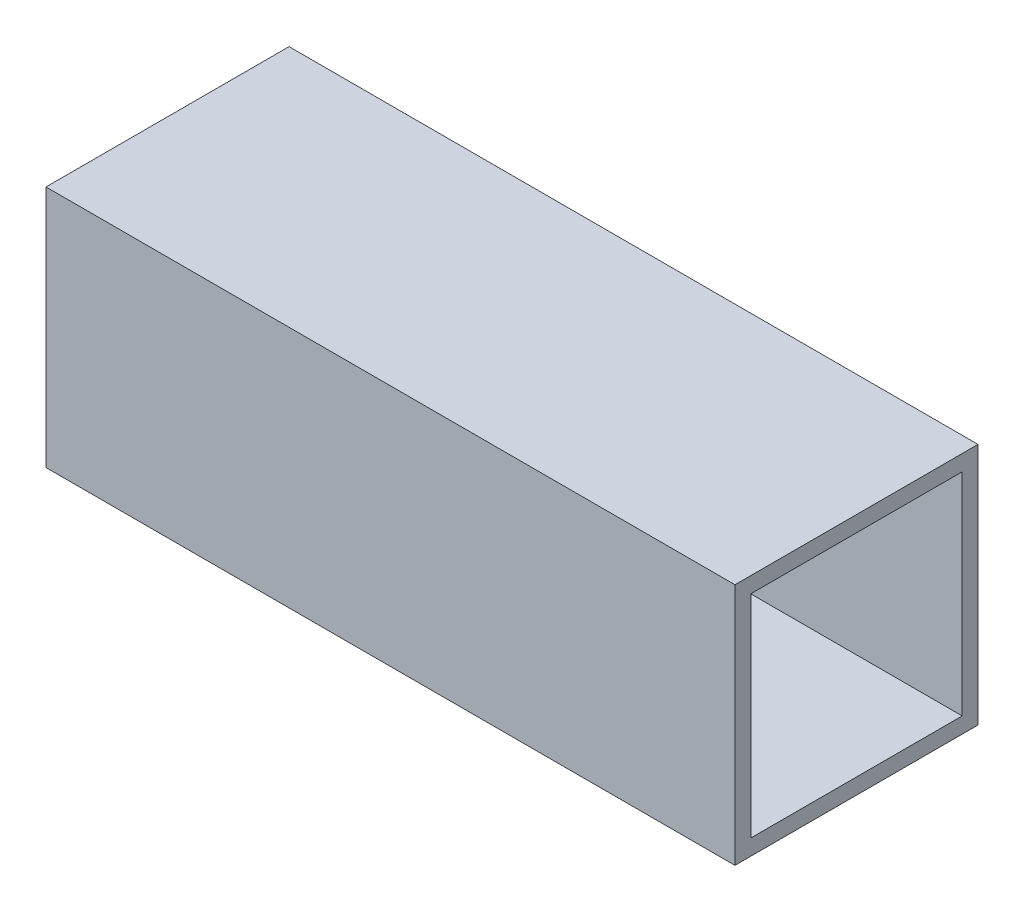
ISO-10303-21;
HEADER;
FILE_DESCRIPTION(('STEP AP214'),'2;1');
FILE_NAME('part.step','',(''),(''),'','','');
FILE_SCHEMA(('AUTOMOTIVE_DESIGN { 1 0 10303 214 1 1 1 1 }'));
ENDSEC;
DATA;
#1=APPLICATION_CONTEXT('core data for automotive mechanical design processes');
#2=APPLICATION_PROTOCOL_DEFINITION('international standard','automotive_design',2000,#1);
#3=PRODUCT_CONTEXT('',#1,'mechanical');
#4=PRODUCT('Part','Part','',(#3));
#5=PRODUCT_RELATED_PRODUCT_CATEGORY('part','',(#4));
#6=PRODUCT_DEFINITION_FORMATION('','',#4);
#7=PRODUCT_DEFINITION_CONTEXT('part definition',#1,'design');
#8=PRODUCT_DEFINITION('design','',#6,#7);
#9=PRODUCT_DEFINITION_SHAPE('','',#8);
#10=(LENGTH_UNIT() NAMED_UNIT(*) SI_UNIT(.MILLI.,.METRE.));
#11=(NAMED_UNIT(*) PLANE_ANGLE_UNIT() SI_UNIT($,.RADIAN.));
#12=(NAMED_UNIT(*) SI_UNIT($,.STERADIAN.) SOLID_ANGLE_UNIT());
#13=UNCERTAINTY_MEASURE_WITH_UNIT(LENGTH_MEASURE(1.E-05),#10,'distance_accuracy_value','');
#14=(GEOMETRIC_REPRESENTATION_CONTEXT(3) GLOBAL_UNCERTAINTY_ASSIGNED_CONTEXT((#13)) GLOBAL_UNIT_ASSIGNED_CONTEXT((#10,
#11,#12)) REPRESENTATION_CONTEXT('',''));
#15=CARTESIAN_POINT('',(0.,0.,0.));
#16=DIRECTION('',(0.,0.,1.));
#17=DIRECTION('',(1.,0.,0.));
#18=AXIS2_PLACEMENT_3D('',#15,#16,#17);
#19=CARTESIAN_POINT('',(72.,12.7,-12.7));
#20=DIRECTION('',(0.,0.,1.));
#21=DIRECTION('',(1.,0.,0.));
#22=AXIS2_PLACEMENT_3D('',#19,#20,#21);
#23=PLANE('',#22);
#24=DIRECTION('',(0.,1.,0.));
#25=VECTOR('',#24,1.);
#26=CARTESIAN_POINT('',(0.,12.7,-12.7));
#27=LINE('',#26,#25);
#28=CARTESIAN_POINT('',(0.,-12.7,-12.7));
#29=VERTEX_POINT('',#28);
#30=CARTESIAN_POINT('',(0.,12.7,-12.7));
#31=VERTEX_POINT('',#30);
#32=EDGE_CURVE('E177',#29,#31,#27,.T.);
#33=ORIENTED_EDGE('',*,*,#32,.T.);
#34=DIRECTION('',(-1.,0.,0.));
#35=VECTOR('',#34,1.);
#36=CARTESIAN_POINT('',(72.,12.7,-12.7));
#37=LINE('',#36,#35);
#38=CARTESIAN_POINT('',(72.,12.7,-12.7));
#39=VERTEX_POINT('',#38);
#40=EDGE_CURVE('E12',#39,#31,#37,.T.);
#41=ORIENTED_EDGE('',*,*,#40,.F.);
#42=DIRECTION('',(0.,1.,0.));
#43=VECTOR('',#42,1.);
#44=CARTESIAN_POINT('',(72.,12.7,-12.7));
#45=LINE('',#44,#43);
#46=CARTESIAN_POINT('',(72.,-12.7,-12.7));
#47=VERTEX_POINT('',#46);
#48=EDGE_CURVE('E143',#47,#39,#45,.T.);
#49=ORIENTED_EDGE('',*,*,#48,.F.);
#50=DIRECTION('',(-1.,0.,0.));
#51=VECTOR('',#50,1.);
#52=CARTESIAN_POINT('',(72.,-12.7,-12.7));
#53=LINE('',#52,#51);
#54=EDGE_CURVE('E188',#47,#29,#53,.T.);
#55=ORIENTED_EDGE('',*,*,#54,.T.);
#56=EDGE_LOOP('',(#33,#41,#49,#55));
#57=FACE_BOUND('',#56,.T.);
#58=ADVANCED_FACE('F61',(#57),#23,.F.);
#59=CARTESIAN_POINT('',(72.,12.7,-12.7));
#60=DIRECTION('',(0.,-1.,0.));
#61=DIRECTION('',(0.,0.,-1.));
#62=AXIS2_PLACEMENT_3D('',#59,#60,#61);
#63=PLANE('',#62);
#64=DIRECTION('',(0.,0.,1.));
#65=VECTOR('',#64,1.);
#66=CARTESIAN_POINT('',(0.,12.7,-12.7));
#67=LINE('',#66,#65);
#68=CARTESIAN_POINT('',(0.,12.7,12.7));
#69=VERTEX_POINT('',#68);
#70=EDGE_CURVE('E149',#31,#69,#67,.T.);
#71=ORIENTED_EDGE('',*,*,#70,.T.);
#72=DIRECTION('',(-1.,0.,0.));
#73=VECTOR('',#72,1.);
#74=CARTESIAN_POINT('',(72.,12.7,12.7));
#75=LINE('',#74,#73);
#76=CARTESIAN_POINT('',(72.,12.7,12.7));
#77=VERTEX_POINT('',#76);
#78=EDGE_CURVE('E72',#77,#69,#75,.T.);
#79=ORIENTED_EDGE('',*,*,#78,.F.);
#80=DIRECTION('',(0.,0.,1.));
#81=VECTOR('',#80,1.);
#82=CARTESIAN_POINT('',(72.,12.7,-12.7));
#83=LINE('',#82,#81);
#84=EDGE_CURVE('E137',#39,#77,#83,.T.);
#85=ORIENTED_EDGE('',*,*,#84,.F.);
#86=ORIENTED_EDGE('',*,*,#40,.T.);
#87=EDGE_LOOP('',(#71,#79,#85,#86));
#88=FACE_BOUND('',#87,.T.);
#89=ADVANCED_FACE('F148',(#88),#63,.F.);
#90=CARTESIAN_POINT('',(72.,-12.7,12.7));
#91=DIRECTION('',(0.,0.,-1.));
#92=DIRECTION('',(0.,1.,0.));
#93=AXIS2_PLACEMENT_3D('',#90,#91,#92);
#94=PLANE('',#93);
#95=DIRECTION('',(0.,-1.,0.));
#96=VECTOR('',#95,1.);
#97=CARTESIAN_POINT('',(0.,-12.7,12.7));
#98=LINE('',#97,#96);
#99=CARTESIAN_POINT('',(0.,-12.7,12.7));
#100=VERTEX_POINT('',#99);
#101=EDGE_CURVE('E110',#69,#100,#98,.T.);
#102=ORIENTED_EDGE('',*,*,#101,.T.);
#103=DIRECTION('',(-1.,0.,0.));
#104=VECTOR('',#103,1.);
#105=CARTESIAN_POINT('',(72.,-12.7,12.7));
#106=LINE('',#105,#104);
#107=CARTESIAN_POINT('',(72.,-12.7,12.7));
#108=VERTEX_POINT('',#107);
#109=EDGE_CURVE('E151',#108,#100,#106,.T.);
#110=ORIENTED_EDGE('',*,*,#109,.F.);
#111=DIRECTION('',(0.,-1.,0.));
#112=VECTOR('',#111,1.);
#113=CARTESIAN_POINT('',(72.,-12.7,12.7));
#114=LINE('',#113,#112);
#115=EDGE_CURVE('E141',#77,#108,#114,.T.);
#116=ORIENTED_EDGE('',*,*,#115,.F.);
#117=ORIENTED_EDGE('',*,*,#78,.T.);
#118=EDGE_LOOP('',(#102,#110,#116,#117));
#119=FACE_BOUND('',#118,.T.);
#120=ADVANCED_FACE('F153',(#119),#94,.F.);
#121=CARTESIAN_POINT('',(72.,11.049,-11.049));
#122=DIRECTION('',(0.,-1.,0.));
#123=DIRECTION('',(0.,0.,-1.));
#124=AXIS2_PLACEMENT_3D('',#121,#122,#123);
#125=PLANE('',#124);
#126=DIRECTION('',(0.,0.,1.));
#127=VECTOR('',#126,1.);
#128=CARTESIAN_POINT('',(0.,11.049,-11.049));
#129=LINE('',#128,#127);
#130=CARTESIAN_POINT('',(0.,11.049,-11.049));
#131=VERTEX_POINT('',#130);
#132=CARTESIAN_POINT('',(0.,11.049,11.049));
#133=VERTEX_POINT('',#132);
#134=EDGE_CURVE('E161',#131,#133,#129,.T.);
#135=ORIENTED_EDGE('',*,*,#134,.F.);
#136=DIRECTION('',(-1.,0.,0.));
#137=VECTOR('',#136,1.);
#138=CARTESIAN_POINT('',(72.,11.049,-11.049));
#139=LINE('',#138,#137);
#140=CARTESIAN_POINT('',(72.,11.049,-11.049));
#141=VERTEX_POINT('',#140);
#142=EDGE_CURVE('E65',#141,#131,#139,.T.);
#143=ORIENTED_EDGE('',*,*,#142,.F.);
#144=DIRECTION('',(0.,0.,1.));
#145=VECTOR('',#144,1.);
#146=CARTESIAN_POINT('',(72.,11.049,-11.049));
#147=LINE('',#146,#145);
#148=CARTESIAN_POINT('',(72.,11.049,11.049));
#149=VERTEX_POINT('',#148);
#150=EDGE_CURVE('E187',#141,#149,#147,.T.);
#151=ORIENTED_EDGE('',*,*,#150,.T.);
#152=DIRECTION('',(-1.,0.,0.));
#153=VECTOR('',#152,1.);
#154=CARTESIAN_POINT('',(72.,11.049,11.049));
#155=LINE('',#154,#153);
#156=EDGE_CURVE('E157',#149,#133,#155,.T.);
#157=ORIENTED_EDGE('',*,*,#156,.T.);
#158=EDGE_LOOP('',(#135,#143,#151,#157));
#159=FACE_BOUND('',#158,.T.);
#160=ADVANCED_FACE('F63',(#159),#125,.T.);
#161=CARTESIAN_POINT('',(72.,11.049,-11.049));
#162=DIRECTION('',(0.,0.,1.));
#163=DIRECTION('',(0.,-1.,0.));
#164=AXIS2_PLACEMENT_3D('',#161,#162,#163);
#165=PLANE('',#164);
#166=DIRECTION('',(0.,1.,0.));
#167=VECTOR('',#166,1.);
#168=CARTESIAN_POINT('',(0.,11.049,-11.049));
#169=LINE('',#168,#167);
#170=CARTESIAN_POINT('',(0.,-11.049,-11.049));
#171=VERTEX_POINT('',#170);
#172=EDGE_CURVE('E165',#171,#131,#169,.T.);
#173=ORIENTED_EDGE('',*,*,#172,.F.);
#174=DIRECTION('',(-1.,0.,0.));
#175=VECTOR('',#174,1.);
#176=CARTESIAN_POINT('',(72.,-11.049,-11.049));
#177=LINE('',#176,#175);
#178=CARTESIAN_POINT('',(72.,-11.049,-11.049));
#179=VERTEX_POINT('',#178);
#180=EDGE_CURVE('E197',#179,#171,#177,.T.);
#181=ORIENTED_EDGE('',*,*,#180,.F.);
#182=DIRECTION('',(0.,1.,0.));
#183=VECTOR('',#182,1.);
#184=CARTESIAN_POINT('',(72.,11.049,-11.049));
#185=LINE('',#184,#183);
#186=EDGE_CURVE('E208',#179,#141,#185,.T.);
#187=ORIENTED_EDGE('',*,*,#186,.T.);
#188=ORIENTED_EDGE('',*,*,#142,.T.);
#189=EDGE_LOOP('',(#173,#181,#187,#188));
#190=FACE_BOUND('',#189,.T.);
#191=ADVANCED_FACE('F206',(#190),#165,.T.);
#192=CARTESIAN_POINT('',(72.,-11.049,11.049));
#193=DIRECTION('',(0.,1.,0.));
#194=DIRECTION('',(0.,0.,1.));
#195=AXIS2_PLACEMENT_3D('',#192,#193,#194);
#196=PLANE('',#195);
#197=DIRECTION('',(0.,0.,-1.));
#198=VECTOR('',#197,1.);
#199=CARTESIAN_POINT('',(0.,-11.049,11.049));
#200=LINE('',#199,#198);
#201=CARTESIAN_POINT('',(0.,-11.049,11.049));
#202=VERTEX_POINT('',#201);
#203=EDGE_CURVE('E169',#202,#171,#200,.T.);
#204=ORIENTED_EDGE('',*,*,#203,.F.);
#205=DIRECTION('',(-1.,0.,0.));
#206=VECTOR('',#205,1.);
#207=CARTESIAN_POINT('',(72.,-11.049,11.049));
#208=LINE('',#207,#206);
#209=CARTESIAN_POINT('',(72.,-11.049,11.049));
#210=VERTEX_POINT('',#209);
#211=EDGE_CURVE('E195',#210,#202,#208,.T.);
#212=ORIENTED_EDGE('',*,*,#211,.F.);
#213=DIRECTION('',(0.,0.,-1.));
#214=VECTOR('',#213,1.);
#215=CARTESIAN_POINT('',(72.,-11.049,11.049));
#216=LINE('',#215,#214);
#217=EDGE_CURVE('E215',#210,#179,#216,.T.);
#218=ORIENTED_EDGE('',*,*,#217,.T.);
#219=ORIENTED_EDGE('',*,*,#180,.T.);
#220=EDGE_LOOP('',(#204,#212,#218,#219));
#221=FACE_BOUND('',#220,.T.);
#222=ADVANCED_FACE('F213',(#221),#196,.T.);
#223=CARTESIAN_POINT('',(72.,-11.049,11.049));
#224=DIRECTION('',(0.,0.,-1.));
#225=DIRECTION('',(0.,1.,0.));
#226=AXIS2_PLACEMENT_3D('',#223,#224,#225);
#227=PLANE('',#226);
#228=DIRECTION('',(0.,-1.,0.));
#229=VECTOR('',#228,1.);
#230=CARTESIAN_POINT('',(0.,-11.049,11.049));
#231=LINE('',#230,#229);
#232=EDGE_CURVE('E173',#133,#202,#231,.T.);
#233=ORIENTED_EDGE('',*,*,#232,.F.);
#234=ORIENTED_EDGE('',*,*,#156,.F.);
#235=DIRECTION('',(0.,-1.,0.));
#236=VECTOR('',#235,1.);
#237=CARTESIAN_POINT('',(72.,-11.049,11.049));
#238=LINE('',#237,#236);
#239=EDGE_CURVE('E220',#149,#210,#238,.T.);
#240=ORIENTED_EDGE('',*,*,#239,.T.);
#241=ORIENTED_EDGE('',*,*,#211,.T.);
#242=EDGE_LOOP('',(#233,#234,#240,#241));
#243=FACE_BOUND('',#242,.T.);
#244=ADVANCED_FACE('F223',(#243),#227,.T.);
#245=CARTESIAN_POINT('',(72.,-12.7,12.7));
#246=DIRECTION('',(0.,1.,0.));
#247=DIRECTION('',(0.,0.,1.));
#248=AXIS2_PLACEMENT_3D('',#245,#246,#247);
#249=PLANE('',#248);
#250=DIRECTION('',(0.,0.,-1.));
#251=VECTOR('',#250,1.);
#252=CARTESIAN_POINT('',(0.,-12.7,12.7));
#253=LINE('',#252,#251);
#254=EDGE_CURVE('E116',#100,#29,#253,.T.);
#255=ORIENTED_EDGE('',*,*,#254,.T.);
#256=ORIENTED_EDGE('',*,*,#54,.F.);
#257=DIRECTION('',(0.,0.,-1.));
#258=VECTOR('',#257,1.);
#259=CARTESIAN_POINT('',(72.,-12.7,12.7));
#260=LINE('',#259,#258);
#261=EDGE_CURVE('E81',#108,#47,#260,.T.);
#262=ORIENTED_EDGE('',*,*,#261,.F.);
#263=ORIENTED_EDGE('',*,*,#109,.T.);
#264=EDGE_LOOP('',(#255,#256,#262,#263));
#265=FACE_BOUND('',#264,.T.);
#266=ADVANCED_FACE('F232',(#265),#249,.F.);
#267=CARTESIAN_POINT('',(72.,0.,0.));
#268=DIRECTION('',(1.,0.,0.));
#269=DIRECTION('',(0.,0.,-1.));
#270=AXIS2_PLACEMENT_3D('',#267,#268,#269);
#271=PLANE('',#270);
#272=ORIENTED_EDGE('',*,*,#150,.F.);
#273=ORIENTED_EDGE('',*,*,#186,.F.);
#274=ORIENTED_EDGE('',*,*,#217,.F.);
#275=ORIENTED_EDGE('',*,*,#239,.F.);
#276=EDGE_LOOP('',(#272,#273,#274,#275));
#277=FACE_BOUND('',#276,.T.);
#278=ORIENTED_EDGE('',*,*,#48,.T.);
#279=ORIENTED_EDGE('',*,*,#84,.T.);
#280=ORIENTED_EDGE('',*,*,#115,.T.);
#281=ORIENTED_EDGE('',*,*,#261,.T.);
#282=EDGE_LOOP('',(#278,#279,#280,#281));
#283=FACE_BOUND('',#282,.T.);
#284=ADVANCED_FACE('F139',(#277,#283),#271,.T.);
#285=CARTESIAN_POINT('',(0.,0.,0.));
#286=DIRECTION('',(1.,0.,0.));
#287=DIRECTION('',(0.,0.,-1.));
#288=AXIS2_PLACEMENT_3D('',#285,#286,#287);
#289=PLANE('',#288);
#290=ORIENTED_EDGE('',*,*,#134,.T.);
#291=ORIENTED_EDGE('',*,*,#232,.T.);
#292=ORIENTED_EDGE('',*,*,#203,.T.);
#293=ORIENTED_EDGE('',*,*,#172,.T.);
#294=EDGE_LOOP('',(#290,#291,#292,#293));
#295=FACE_BOUND('',#294,.T.);
#296=ORIENTED_EDGE('',*,*,#32,.F.);
#297=ORIENTED_EDGE('',*,*,#254,.F.);
#298=ORIENTED_EDGE('',*,*,#101,.F.);
#299=ORIENTED_EDGE('',*,*,#70,.F.);
#300=EDGE_LOOP('',(#296,#297,#298,#299));
#301=FACE_BOUND('',#300,.T.);
#302=ADVANCED_FACE('F211',(#295,#301),#289,.F.);
#303=CLOSED_SHELL('',(#58,#89,#120,#160,#191,#222,#244,#266,#284,#302));
#304=MANIFOLD_SOLID_BREP('B2',#303);
#305=ADVANCED_BREP_SHAPE_REPRESENTATION('',(#18,#304),#14);
#306=SHAPE_DEFINITION_REPRESENTATION(#9,#305);
ENDSEC;
END-ISO-10303-21;
